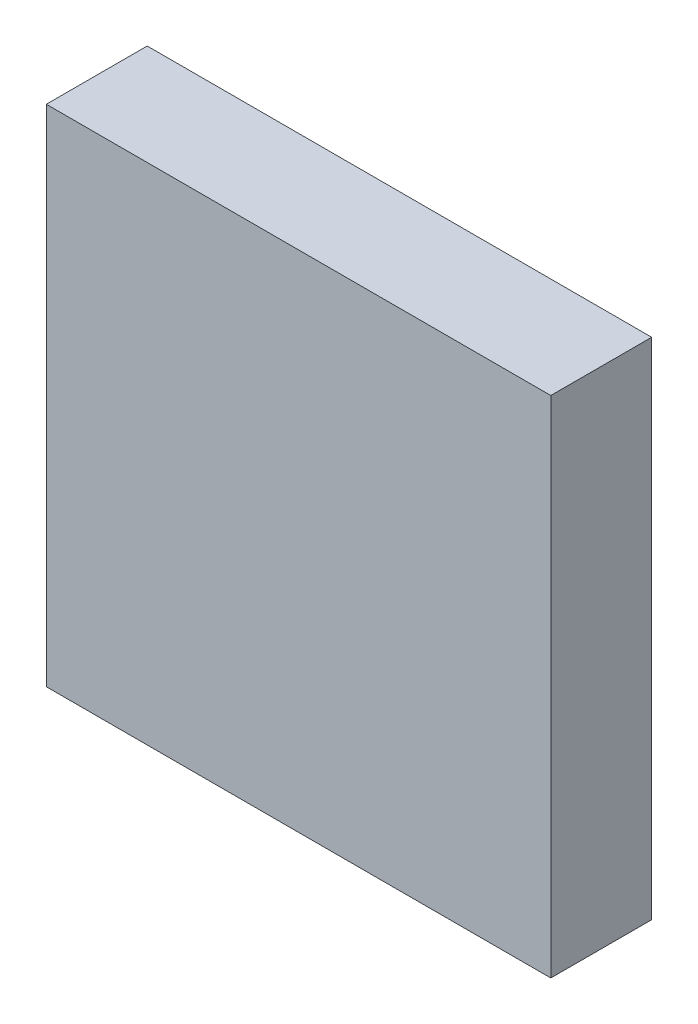
ISO-10303-21;
HEADER;
FILE_DESCRIPTION(('STEP AP214'),'2;1');
FILE_NAME('part.step','',(''),(''),'','','');
FILE_SCHEMA(('AUTOMOTIVE_DESIGN { 1 0 10303 214 1 1 1 1 }'));
ENDSEC;
DATA;
#1=APPLICATION_CONTEXT('core data for automotive mechanical design processes');
#2=APPLICATION_PROTOCOL_DEFINITION('international standard','automotive_design',2000,#1);
#3=PRODUCT_CONTEXT('',#1,'mechanical');
#4=PRODUCT('Part','Part','',(#3));
#5=PRODUCT_RELATED_PRODUCT_CATEGORY('part','',(#4));
#6=PRODUCT_DEFINITION_FORMATION('','',#4);
#7=PRODUCT_DEFINITION_CONTEXT('part definition',#1,'design');
#8=PRODUCT_DEFINITION('design','',#6,#7);
#9=PRODUCT_DEFINITION_SHAPE('','',#8);
#10=(LENGTH_UNIT() NAMED_UNIT(*) SI_UNIT(.MILLI.,.METRE.));
#11=(NAMED_UNIT(*) PLANE_ANGLE_UNIT() SI_UNIT($,.RADIAN.));
#12=(NAMED_UNIT(*) SI_UNIT($,.STERADIAN.) SOLID_ANGLE_UNIT());
#13=UNCERTAINTY_MEASURE_WITH_UNIT(LENGTH_MEASURE(1.E-05),#10,'distance_accuracy_value','');
#14=(GEOMETRIC_REPRESENTATION_CONTEXT(3) GLOBAL_UNCERTAINTY_ASSIGNED_CONTEXT((#13)) GLOBAL_UNIT_ASSIGNED_CONTEXT((#10,
#11,#12)) REPRESENTATION_CONTEXT('',''));
#15=CARTESIAN_POINT('',(0.,0.,0.));
#16=DIRECTION('',(0.,0.,1.));
#17=DIRECTION('',(1.,0.,0.));
#18=AXIS2_PLACEMENT_3D('',#15,#16,#17);
#19=CARTESIAN_POINT('',(0.,0.,4.));
#20=DIRECTION('',(1.,0.,0.));
#21=DIRECTION('',(0.,0.,-1.));
#22=AXIS2_PLACEMENT_3D('',#19,#20,#21);
#23=PLANE('',#22);
#24=DIRECTION('',(0.,-1.,0.));
#25=VECTOR('',#24,1.);
#26=CARTESIAN_POINT('',(0.,0.,0.));
#27=LINE('',#26,#25);
#28=CARTESIAN_POINT('',(0.,20.,0.));
#29=VERTEX_POINT('',#28);
#30=CARTESIAN_POINT('',(0.,0.,0.));
#31=VERTEX_POINT('',#30);
#32=EDGE_CURVE('E104',#29,#31,#27,.T.);
#33=ORIENTED_EDGE('',*,*,#32,.T.);
#34=DIRECTION('',(0.,0.,-1.));
#35=VECTOR('',#34,1.);
#36=CARTESIAN_POINT('',(0.,0.,4.));
#37=LINE('',#36,#35);
#38=CARTESIAN_POINT('',(0.,0.,4.));
#39=VERTEX_POINT('',#38);
#40=EDGE_CURVE('E11',#39,#31,#37,.T.);
#41=ORIENTED_EDGE('',*,*,#40,.F.);
#42=DIRECTION('',(0.,-1.,0.));
#43=VECTOR('',#42,1.);
#44=CARTESIAN_POINT('',(0.,0.,4.));
#45=LINE('',#44,#43);
#46=CARTESIAN_POINT('',(0.,20.,4.));
#47=VERTEX_POINT('',#46);
#48=EDGE_CURVE('E92',#47,#39,#45,.T.);
#49=ORIENTED_EDGE('',*,*,#48,.F.);
#50=DIRECTION('',(0.,0.,-1.));
#51=VECTOR('',#50,1.);
#52=CARTESIAN_POINT('',(0.,20.,4.));
#53=LINE('',#52,#51);
#54=EDGE_CURVE('E100',#47,#29,#53,.T.);
#55=ORIENTED_EDGE('',*,*,#54,.T.);
#56=EDGE_LOOP('',(#33,#41,#49,#55));
#57=FACE_BOUND('',#56,.T.);
#58=ADVANCED_FACE('F41',(#57),#23,.F.);
#59=CARTESIAN_POINT('',(0.,0.,4.));
#60=DIRECTION('',(0.,1.,0.));
#61=DIRECTION('',(0.,0.,1.));
#62=AXIS2_PLACEMENT_3D('',#59,#60,#61);
#63=PLANE('',#62);
#64=DIRECTION('',(1.,0.,0.));
#65=VECTOR('',#64,1.);
#66=CARTESIAN_POINT('',(0.,0.,0.));
#67=LINE('',#66,#65);
#68=CARTESIAN_POINT('',(20.,0.,0.));
#69=VERTEX_POINT('',#68);
#70=EDGE_CURVE('E96',#31,#69,#67,.T.);
#71=ORIENTED_EDGE('',*,*,#70,.T.);
#72=DIRECTION('',(0.,0.,-1.));
#73=VECTOR('',#72,1.);
#74=CARTESIAN_POINT('',(20.,0.,4.));
#75=LINE('',#74,#73);
#76=CARTESIAN_POINT('',(20.,0.,4.));
#77=VERTEX_POINT('',#76);
#78=EDGE_CURVE('E49',#77,#69,#75,.T.);
#79=ORIENTED_EDGE('',*,*,#78,.F.);
#80=DIRECTION('',(1.,0.,0.));
#81=VECTOR('',#80,1.);
#82=CARTESIAN_POINT('',(0.,0.,4.));
#83=LINE('',#82,#81);
#84=EDGE_CURVE('E87',#39,#77,#83,.T.);
#85=ORIENTED_EDGE('',*,*,#84,.F.);
#86=ORIENTED_EDGE('',*,*,#40,.T.);
#87=EDGE_LOOP('',(#71,#79,#85,#86));
#88=FACE_BOUND('',#87,.T.);
#89=ADVANCED_FACE('F95',(#88),#63,.F.);
#90=CARTESIAN_POINT('',(20.,0.,4.));
#91=DIRECTION('',(-1.,0.,0.));
#92=DIRECTION('',(0.,0.,1.));
#93=AXIS2_PLACEMENT_3D('',#90,#91,#92);
#94=PLANE('',#93);
#95=DIRECTION('',(0.,1.,0.));
#96=VECTOR('',#95,1.);
#97=CARTESIAN_POINT('',(20.,0.,0.));
#98=LINE('',#97,#96);
#99=CARTESIAN_POINT('',(20.,20.,0.));
#100=VERTEX_POINT('',#99);
#101=EDGE_CURVE('E74',#69,#100,#98,.T.);
#102=ORIENTED_EDGE('',*,*,#101,.T.);
#103=DIRECTION('',(0.,0.,-1.));
#104=VECTOR('',#103,1.);
#105=CARTESIAN_POINT('',(20.,20.,4.));
#106=LINE('',#105,#104);
#107=CARTESIAN_POINT('',(20.,20.,4.));
#108=VERTEX_POINT('',#107);
#109=EDGE_CURVE('E97',#108,#100,#106,.T.);
#110=ORIENTED_EDGE('',*,*,#109,.F.);
#111=DIRECTION('',(0.,1.,0.));
#112=VECTOR('',#111,1.);
#113=CARTESIAN_POINT('',(20.,0.,4.));
#114=LINE('',#113,#112);
#115=EDGE_CURVE('E90',#77,#108,#114,.T.);
#116=ORIENTED_EDGE('',*,*,#115,.F.);
#117=ORIENTED_EDGE('',*,*,#78,.T.);
#118=EDGE_LOOP('',(#102,#110,#116,#117));
#119=FACE_BOUND('',#118,.T.);
#120=ADVANCED_FACE('F98',(#119),#94,.F.);
#121=CARTESIAN_POINT('',(0.,20.,4.));
#122=DIRECTION('',(0.,-1.,0.));
#123=DIRECTION('',(0.,0.,-1.));
#124=AXIS2_PLACEMENT_3D('',#121,#122,#123);
#125=PLANE('',#124);
#126=DIRECTION('',(-1.,0.,0.));
#127=VECTOR('',#126,1.);
#128=CARTESIAN_POINT('',(0.,20.,0.));
#129=LINE('',#128,#127);
#130=EDGE_CURVE('E80',#100,#29,#129,.T.);
#131=ORIENTED_EDGE('',*,*,#130,.T.);
#132=ORIENTED_EDGE('',*,*,#54,.F.);
#133=DIRECTION('',(-1.,0.,0.));
#134=VECTOR('',#133,1.);
#135=CARTESIAN_POINT('',(0.,20.,4.));
#136=LINE('',#135,#134);
#137=EDGE_CURVE('E57',#108,#47,#136,.T.);
#138=ORIENTED_EDGE('',*,*,#137,.F.);
#139=ORIENTED_EDGE('',*,*,#109,.T.);
#140=EDGE_LOOP('',(#131,#132,#138,#139));
#141=FACE_BOUND('',#140,.T.);
#142=ADVANCED_FACE('F111',(#141),#125,.F.);
#143=CARTESIAN_POINT('',(0.,0.,4.));
#144=DIRECTION('',(0.,0.,-1.));
#145=DIRECTION('',(-1.,0.,0.));
#146=AXIS2_PLACEMENT_3D('',#143,#144,#145);
#147=PLANE('',#146);
#148=ORIENTED_EDGE('',*,*,#48,.T.);
#149=ORIENTED_EDGE('',*,*,#84,.T.);
#150=ORIENTED_EDGE('',*,*,#115,.T.);
#151=ORIENTED_EDGE('',*,*,#137,.T.);
#152=EDGE_LOOP('',(#148,#149,#150,#151));
#153=FACE_BOUND('',#152,.T.);
#154=ADVANCED_FACE('F88',(#153),#147,.F.);
#155=CARTESIAN_POINT('',(0.,0.,0.));
#156=DIRECTION('',(0.,0.,-1.));
#157=DIRECTION('',(-1.,0.,0.));
#158=AXIS2_PLACEMENT_3D('',#155,#156,#157);
#159=PLANE('',#158);
#160=ORIENTED_EDGE('',*,*,#32,.F.);
#161=ORIENTED_EDGE('',*,*,#130,.F.);
#162=ORIENTED_EDGE('',*,*,#101,.F.);
#163=ORIENTED_EDGE('',*,*,#70,.F.);
#164=EDGE_LOOP('',(#160,#161,#162,#163));
#165=FACE_BOUND('',#164,.T.);
#166=ADVANCED_FACE('F114',(#165),#159,.T.);
#167=CLOSED_SHELL('',(#58,#89,#120,#142,#154,#166));
#168=MANIFOLD_SOLID_BREP('B2',#167);
#169=ADVANCED_BREP_SHAPE_REPRESENTATION('',(#18,#168),#14);
#170=SHAPE_DEFINITION_REPRESENTATION(#9,#169);
ENDSEC;
END-ISO-10303-21;
